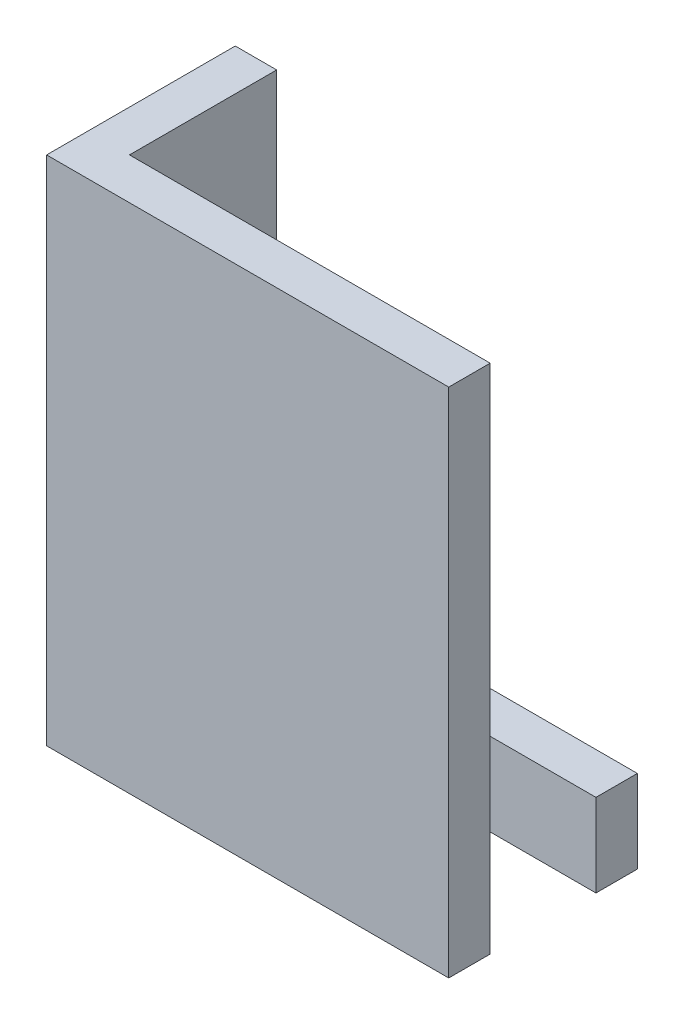
ISO-10303-21;
HEADER;
FILE_DESCRIPTION(('STEP AP214'),'2;1');
FILE_NAME('part.step','',(''),(''),'','','');
FILE_SCHEMA(('AUTOMOTIVE_DESIGN { 1 0 10303 214 1 1 1 1 }'));
ENDSEC;
DATA;
#1=APPLICATION_CONTEXT('core data for automotive mechanical design processes');
#2=APPLICATION_PROTOCOL_DEFINITION('international standard','automotive_design',2000,#1);
#3=PRODUCT_CONTEXT('',#1,'mechanical');
#4=PRODUCT('Part','Part','',(#3));
#5=PRODUCT_RELATED_PRODUCT_CATEGORY('part','',(#4));
#6=PRODUCT_DEFINITION_FORMATION('','',#4);
#7=PRODUCT_DEFINITION_CONTEXT('part definition',#1,'design');
#8=PRODUCT_DEFINITION('design','',#6,#7);
#9=PRODUCT_DEFINITION_SHAPE('','',#8);
#10=(LENGTH_UNIT() NAMED_UNIT(*) SI_UNIT(.MILLI.,.METRE.));
#11=(NAMED_UNIT(*) PLANE_ANGLE_UNIT() SI_UNIT($,.RADIAN.));
#12=(NAMED_UNIT(*) SI_UNIT($,.STERADIAN.) SOLID_ANGLE_UNIT());
#13=UNCERTAINTY_MEASURE_WITH_UNIT(LENGTH_MEASURE(1.E-05),#10,'distance_accuracy_value','');
#14=(GEOMETRIC_REPRESENTATION_CONTEXT(3) GLOBAL_UNCERTAINTY_ASSIGNED_CONTEXT((#13)) GLOBAL_UNIT_ASSIGNED_CONTEXT((#10,
#11,#12)) REPRESENTATION_CONTEXT('',''));
#15=CARTESIAN_POINT('',(0.,0.,0.));
#16=DIRECTION('',(0.,0.,1.));
#17=DIRECTION('',(1.,0.,0.));
#18=AXIS2_PLACEMENT_3D('',#15,#16,#17);
#19=CARTESIAN_POINT('',(0.244892720885212,37.06,8.58850832049055));
#20=DIRECTION('',(-1.,0.,0.));
#21=DIRECTION('',(0.,0.,1.));
#22=AXIS2_PLACEMENT_3D('',#19,#20,#21);
#23=PLANE('',#22);
#24=DIRECTION('',(0.,-1.,0.));
#25=VECTOR('',#24,1.);
#26=CARTESIAN_POINT('',(0.244892720885214,6.,11.5885083204905));
#27=LINE('',#26,#25);
#28=CARTESIAN_POINT('',(0.244892720885212,6.,11.5885083204905));
#29=VERTEX_POINT('',#28);
#30=CARTESIAN_POINT('',(0.244892720885212,0.,11.5885083204905));
#31=VERTEX_POINT('',#30);
#32=EDGE_CURVE('E55',#29,#31,#27,.T.);
#33=ORIENTED_EDGE('',*,*,#32,.F.);
#34=DIRECTION('',(0.,0.,1.));
#35=VECTOR('',#34,1.);
#36=CARTESIAN_POINT('',(0.244892720885214,6.,8.58850832049055));
#37=LINE('',#36,#35);
#38=CARTESIAN_POINT('',(0.244892720885212,6.,8.58850832049055));
#39=VERTEX_POINT('',#38);
#40=EDGE_CURVE('E60',#39,#29,#37,.T.);
#41=ORIENTED_EDGE('',*,*,#40,.F.);
#42=DIRECTION('',(0.,-1.,0.));
#43=VECTOR('',#42,1.);
#44=CARTESIAN_POINT('',(0.244892720885212,37.06,8.58850832049055));
#45=LINE('',#44,#43);
#46=CARTESIAN_POINT('',(0.244892720885212,37.06,8.58850832049055));
#47=VERTEX_POINT('',#46);
#48=EDGE_CURVE('E170',#47,#39,#45,.T.);
#49=ORIENTED_EDGE('',*,*,#48,.F.);
#50=DIRECTION('',(0.,0.,-1.));
#51=VECTOR('',#50,1.);
#52=CARTESIAN_POINT('',(0.244892720885212,37.06,8.58850832049055));
#53=LINE('',#52,#51);
#54=CARTESIAN_POINT('',(0.244892720885214,37.06,19.2485083204905));
#55=VERTEX_POINT('',#54);
#56=EDGE_CURVE('E167',#55,#47,#53,.T.);
#57=ORIENTED_EDGE('',*,*,#56,.F.);
#58=DIRECTION('',(0.,-1.,0.));
#59=VECTOR('',#58,1.);
#60=CARTESIAN_POINT('',(0.244892720885214,37.06,19.2485083204905));
#61=LINE('',#60,#59);
#62=CARTESIAN_POINT('',(0.244892720885214,0.,19.2485083204905));
#63=VERTEX_POINT('',#62);
#64=EDGE_CURVE('E190',#55,#63,#61,.T.);
#65=ORIENTED_EDGE('',*,*,#64,.T.);
#66=DIRECTION('',(0.,0.,-1.));
#67=VECTOR('',#66,1.);
#68=CARTESIAN_POINT('',(0.244892720885212,0.,8.58850832049055));
#69=LINE('',#68,#67);
#70=EDGE_CURVE('E155',#63,#31,#69,.T.);
#71=ORIENTED_EDGE('',*,*,#70,.T.);
#72=EDGE_LOOP('',(#33,#41,#49,#57,#65,#71));
#73=FACE_BOUND('',#72,.T.);
#74=ADVANCED_FACE('F39',(#73),#23,.F.);
#75=CARTESIAN_POINT('',(-2.75510727911479,37.06,8.58850832049055));
#76=DIRECTION('',(0.,0.,1.));
#77=DIRECTION('',(1.,0.,0.));
#78=AXIS2_PLACEMENT_3D('',#75,#76,#77);
#79=PLANE('',#78);
#80=DIRECTION('',(-1.,0.,0.));
#81=VECTOR('',#80,1.);
#82=CARTESIAN_POINT('',(-2.75510727911479,0.,8.58850832049055));
#83=LINE('',#82,#81);
#84=CARTESIAN_POINT('',(26.3648927208852,0.,8.58850832049055));
#85=VERTEX_POINT('',#84);
#86=CARTESIAN_POINT('',(-2.75510727911479,0.,8.58850832049055));
#87=VERTEX_POINT('',#86);
#88=EDGE_CURVE('E149',#85,#87,#83,.T.);
#89=ORIENTED_EDGE('',*,*,#88,.T.);
#90=DIRECTION('',(0.,-1.,0.));
#91=VECTOR('',#90,1.);
#92=CARTESIAN_POINT('',(-2.75510727911479,37.06,8.58850832049055));
#93=LINE('',#92,#91);
#94=CARTESIAN_POINT('',(-2.75510727911479,37.06,8.58850832049055));
#95=VERTEX_POINT('',#94);
#96=EDGE_CURVE('E11',#95,#87,#93,.T.);
#97=ORIENTED_EDGE('',*,*,#96,.F.);
#98=DIRECTION('',(-1.,0.,0.));
#99=VECTOR('',#98,1.);
#100=CARTESIAN_POINT('',(-2.75510727911479,37.06,8.58850832049055));
#101=LINE('',#100,#99);
#102=EDGE_CURVE('E150',#47,#95,#101,.T.);
#103=ORIENTED_EDGE('',*,*,#102,.F.);
#104=ORIENTED_EDGE('',*,*,#48,.T.);
#105=DIRECTION('',(-1.,0.,0.));
#106=VECTOR('',#105,1.);
#107=CARTESIAN_POINT('',(26.3648927208852,6.,8.58850832049055));
#108=LINE('',#107,#106);
#109=CARTESIAN_POINT('',(26.3648927208852,6.,8.58850832049055));
#110=VERTEX_POINT('',#109);
#111=EDGE_CURVE('E134',#110,#39,#108,.T.);
#112=ORIENTED_EDGE('',*,*,#111,.F.);
#113=DIRECTION('',(0.,-1.,0.));
#114=VECTOR('',#113,1.);
#115=CARTESIAN_POINT('',(26.3648927208852,6.,8.58850832049055));
#116=LINE('',#115,#114);
#117=EDGE_CURVE('E128',#110,#85,#116,.T.);
#118=ORIENTED_EDGE('',*,*,#117,.T.);
#119=EDGE_LOOP('',(#89,#97,#103,#104,#112,#118));
#120=FACE_BOUND('',#119,.T.);
#121=ADVANCED_FACE('F41',(#120),#79,.F.);
#122=CARTESIAN_POINT('',(-2.75510727911479,37.06,8.58850832049055));
#123=DIRECTION('',(1.,0.,0.));
#124=DIRECTION('',(0.,0.,-1.));
#125=AXIS2_PLACEMENT_3D('',#122,#123,#124);
#126=PLANE('',#125);
#127=DIRECTION('',(0.,0.,1.));
#128=VECTOR('',#127,1.);
#129=CARTESIAN_POINT('',(-2.75510727911479,0.,8.58850832049055));
#130=LINE('',#129,#128);
#131=CARTESIAN_POINT('',(-2.75510727911479,0.,22.2485083204905));
#132=VERTEX_POINT('',#131);
#133=EDGE_CURVE('E174',#87,#132,#130,.T.);
#134=ORIENTED_EDGE('',*,*,#133,.T.);
#135=DIRECTION('',(0.,-1.,0.));
#136=VECTOR('',#135,1.);
#137=CARTESIAN_POINT('',(-2.75510727911479,37.06,22.2485083204905));
#138=LINE('',#137,#136);
#139=CARTESIAN_POINT('',(-2.75510727911479,37.06,22.2485083204905));
#140=VERTEX_POINT('',#139);
#141=EDGE_CURVE('E48',#140,#132,#138,.T.);
#142=ORIENTED_EDGE('',*,*,#141,.F.);
#143=DIRECTION('',(0.,0.,1.));
#144=VECTOR('',#143,1.);
#145=CARTESIAN_POINT('',(-2.75510727911479,37.06,8.58850832049055));
#146=LINE('',#145,#144);
#147=EDGE_CURVE('E154',#95,#140,#146,.T.);
#148=ORIENTED_EDGE('',*,*,#147,.F.);
#149=ORIENTED_EDGE('',*,*,#96,.T.);
#150=EDGE_LOOP('',(#134,#142,#148,#149));
#151=FACE_BOUND('',#150,.T.);
#152=ADVANCED_FACE('F228',(#151),#126,.F.);
#153=CARTESIAN_POINT('',(-2.75510727911479,37.06,22.2485083204905));
#154=DIRECTION('',(0.,0.,-1.));
#155=DIRECTION('',(-1.,0.,0.));
#156=AXIS2_PLACEMENT_3D('',#153,#154,#155);
#157=PLANE('',#156);
#158=DIRECTION('',(1.,0.,0.));
#159=VECTOR('',#158,1.);
#160=CARTESIAN_POINT('',(-2.75510727911479,0.,22.2485083204905));
#161=LINE('',#160,#159);
#162=CARTESIAN_POINT('',(26.3648927208852,0.,22.2485083204905));
#163=VERTEX_POINT('',#162);
#164=EDGE_CURVE('E177',#132,#163,#161,.T.);
#165=ORIENTED_EDGE('',*,*,#164,.T.);
#166=DIRECTION('',(0.,-1.,0.));
#167=VECTOR('',#166,1.);
#168=CARTESIAN_POINT('',(26.3648927208852,37.06,22.2485083204905));
#169=LINE('',#168,#167);
#170=CARTESIAN_POINT('',(26.3648927208852,37.06,22.2485083204905));
#171=VERTEX_POINT('',#170);
#172=EDGE_CURVE('E198',#171,#163,#169,.T.);
#173=ORIENTED_EDGE('',*,*,#172,.F.);
#174=DIRECTION('',(1.,0.,0.));
#175=VECTOR('',#174,1.);
#176=CARTESIAN_POINT('',(-2.75510727911479,37.06,22.2485083204905));
#177=LINE('',#176,#175);
#178=EDGE_CURVE('E158',#140,#171,#177,.T.);
#179=ORIENTED_EDGE('',*,*,#178,.F.);
#180=ORIENTED_EDGE('',*,*,#141,.T.);
#181=EDGE_LOOP('',(#165,#173,#179,#180));
#182=FACE_BOUND('',#181,.T.);
#183=ADVANCED_FACE('F207',(#182),#157,.F.);
#184=CARTESIAN_POINT('',(26.3648927208852,37.06,19.2485083204905));
#185=DIRECTION('',(-1.,0.,0.));
#186=DIRECTION('',(0.,0.,1.));
#187=AXIS2_PLACEMENT_3D('',#184,#185,#186);
#188=PLANE('',#187);
#189=DIRECTION('',(0.,0.,-1.));
#190=VECTOR('',#189,1.);
#191=CARTESIAN_POINT('',(26.3648927208852,0.,19.2485083204905));
#192=LINE('',#191,#190);
#193=CARTESIAN_POINT('',(26.3648927208852,0.,19.2485083204905));
#194=VERTEX_POINT('',#193);
#195=EDGE_CURVE('E180',#163,#194,#192,.T.);
#196=ORIENTED_EDGE('',*,*,#195,.T.);
#197=DIRECTION('',(0.,-1.,0.));
#198=VECTOR('',#197,1.);
#199=CARTESIAN_POINT('',(26.3648927208852,37.06,19.2485083204905));
#200=LINE('',#199,#198);
#201=CARTESIAN_POINT('',(26.3648927208852,37.06,19.2485083204905));
#202=VERTEX_POINT('',#201);
#203=EDGE_CURVE('E194',#202,#194,#200,.T.);
#204=ORIENTED_EDGE('',*,*,#203,.F.);
#205=DIRECTION('',(0.,0.,-1.));
#206=VECTOR('',#205,1.);
#207=CARTESIAN_POINT('',(26.3648927208852,37.06,19.2485083204905));
#208=LINE('',#207,#206);
#209=EDGE_CURVE('E161',#171,#202,#208,.T.);
#210=ORIENTED_EDGE('',*,*,#209,.F.);
#211=ORIENTED_EDGE('',*,*,#172,.T.);
#212=EDGE_LOOP('',(#196,#204,#210,#211));
#213=FACE_BOUND('',#212,.T.);
#214=ADVANCED_FACE('F217',(#213),#188,.F.);
#215=CARTESIAN_POINT('',(0.244892720885214,37.06,19.2485083204905));
#216=DIRECTION('',(0.,0.,1.));
#217=DIRECTION('',(1.,0.,0.));
#218=AXIS2_PLACEMENT_3D('',#215,#216,#217);
#219=PLANE('',#218);
#220=DIRECTION('',(-1.,0.,0.));
#221=VECTOR('',#220,1.);
#222=CARTESIAN_POINT('',(0.244892720885214,0.,19.2485083204905));
#223=LINE('',#222,#221);
#224=EDGE_CURVE('E183',#194,#63,#223,.T.);
#225=ORIENTED_EDGE('',*,*,#224,.T.);
#226=ORIENTED_EDGE('',*,*,#64,.F.);
#227=DIRECTION('',(-1.,0.,0.));
#228=VECTOR('',#227,1.);
#229=CARTESIAN_POINT('',(0.244892720885214,37.06,19.2485083204905));
#230=LINE('',#229,#228);
#231=EDGE_CURVE('E164',#202,#55,#230,.T.);
#232=ORIENTED_EDGE('',*,*,#231,.F.);
#233=ORIENTED_EDGE('',*,*,#203,.T.);
#234=EDGE_LOOP('',(#225,#226,#232,#233));
#235=FACE_BOUND('',#234,.T.);
#236=ADVANCED_FACE('F221',(#235),#219,.F.);
#237=CARTESIAN_POINT('',(0.,37.06,0.));
#238=DIRECTION('',(0.,-1.,0.));
#239=DIRECTION('',(0.,0.,-1.));
#240=AXIS2_PLACEMENT_3D('',#237,#238,#239);
#241=PLANE('',#240);
#242=ORIENTED_EDGE('',*,*,#102,.T.);
#243=ORIENTED_EDGE('',*,*,#147,.T.);
#244=ORIENTED_EDGE('',*,*,#178,.T.);
#245=ORIENTED_EDGE('',*,*,#209,.T.);
#246=ORIENTED_EDGE('',*,*,#231,.T.);
#247=ORIENTED_EDGE('',*,*,#56,.T.);
#248=EDGE_LOOP('',(#242,#243,#244,#245,#246,#247));
#249=FACE_BOUND('',#248,.T.);
#250=ADVANCED_FACE('F225',(#249),#241,.F.);
#251=CARTESIAN_POINT('',(0.,0.,0.));
#252=DIRECTION('',(0.,-1.,0.));
#253=DIRECTION('',(0.,0.,-1.));
#254=AXIS2_PLACEMENT_3D('',#251,#252,#253);
#255=PLANE('',#254);
#256=ORIENTED_EDGE('',*,*,#88,.F.);
#257=DIRECTION('',(0.,0.,-1.));
#258=VECTOR('',#257,1.);
#259=CARTESIAN_POINT('',(26.3648927208852,0.,11.5885083204905));
#260=LINE('',#259,#258);
#261=CARTESIAN_POINT('',(26.3648927208852,0.,11.5885083204905));
#262=VERTEX_POINT('',#261);
#263=EDGE_CURVE('E142',#262,#85,#260,.T.);
#264=ORIENTED_EDGE('',*,*,#263,.F.);
#265=DIRECTION('',(1.,0.,0.));
#266=VECTOR('',#265,1.);
#267=CARTESIAN_POINT('',(0.244892720885214,0.,11.5885083204905));
#268=LINE('',#267,#266);
#269=EDGE_CURVE('E123',#31,#262,#268,.T.);
#270=ORIENTED_EDGE('',*,*,#269,.F.);
#271=ORIENTED_EDGE('',*,*,#70,.F.);
#272=ORIENTED_EDGE('',*,*,#224,.F.);
#273=ORIENTED_EDGE('',*,*,#195,.F.);
#274=ORIENTED_EDGE('',*,*,#164,.F.);
#275=ORIENTED_EDGE('',*,*,#133,.F.);
#276=EDGE_LOOP('',(#256,#264,#270,#271,#272,#273,#274,#275));
#277=FACE_BOUND('',#276,.T.);
#278=ADVANCED_FACE('F212',(#277),#255,.T.);
#279=CARTESIAN_POINT('',(0.244892720885214,6.,11.5885083204905));
#280=DIRECTION('',(0.,0.,-1.));
#281=DIRECTION('',(-1.,0.,0.));
#282=AXIS2_PLACEMENT_3D('',#279,#280,#281);
#283=PLANE('',#282);
#284=ORIENTED_EDGE('',*,*,#269,.T.);
#285=DIRECTION('',(0.,-1.,0.));
#286=VECTOR('',#285,1.);
#287=CARTESIAN_POINT('',(26.3648927208852,6.,11.5885083204905));
#288=LINE('',#287,#286);
#289=CARTESIAN_POINT('',(26.3648927208852,6.,11.5885083204905));
#290=VERTEX_POINT('',#289);
#291=EDGE_CURVE('E120',#290,#262,#288,.T.);
#292=ORIENTED_EDGE('',*,*,#291,.F.);
#293=DIRECTION('',(1.,0.,0.));
#294=VECTOR('',#293,1.);
#295=CARTESIAN_POINT('',(0.244892720885214,6.,11.5885083204905));
#296=LINE('',#295,#294);
#297=EDGE_CURVE('E109',#29,#290,#296,.T.);
#298=ORIENTED_EDGE('',*,*,#297,.F.);
#299=ORIENTED_EDGE('',*,*,#32,.T.);
#300=EDGE_LOOP('',(#284,#292,#298,#299));
#301=FACE_BOUND('',#300,.T.);
#302=ADVANCED_FACE('F121',(#301),#283,.F.);
#303=CARTESIAN_POINT('',(26.3648927208852,6.,11.5885083204905));
#304=DIRECTION('',(-1.,0.,0.));
#305=DIRECTION('',(0.,0.,1.));
#306=AXIS2_PLACEMENT_3D('',#303,#304,#305);
#307=PLANE('',#306);
#308=ORIENTED_EDGE('',*,*,#263,.T.);
#309=ORIENTED_EDGE('',*,*,#117,.F.);
#310=DIRECTION('',(0.,0.,-1.));
#311=VECTOR('',#310,1.);
#312=CARTESIAN_POINT('',(26.3648927208852,6.,11.5885083204905));
#313=LINE('',#312,#311);
#314=EDGE_CURVE('E114',#290,#110,#313,.T.);
#315=ORIENTED_EDGE('',*,*,#314,.F.);
#316=ORIENTED_EDGE('',*,*,#291,.T.);
#317=EDGE_LOOP('',(#308,#309,#315,#316));
#318=FACE_BOUND('',#317,.T.);
#319=ADVANCED_FACE('F130',(#318),#307,.F.);
#320=CARTESIAN_POINT('',(0.,6.,0.));
#321=DIRECTION('',(0.,1.,0.));
#322=DIRECTION('',(0.,0.,1.));
#323=AXIS2_PLACEMENT_3D('',#320,#321,#322);
#324=PLANE('',#323);
#325=ORIENTED_EDGE('',*,*,#40,.T.);
#326=ORIENTED_EDGE('',*,*,#297,.T.);
#327=ORIENTED_EDGE('',*,*,#314,.T.);
#328=ORIENTED_EDGE('',*,*,#111,.T.);
#329=EDGE_LOOP('',(#325,#326,#327,#328));
#330=FACE_BOUND('',#329,.T.);
#331=ADVANCED_FACE('F111',(#330),#324,.T.);
#332=CLOSED_SHELL('',(#74,#121,#152,#183,#214,#236,#250,#278,#302,#319,#331));
#333=MANIFOLD_SOLID_BREP('B2',#332);
#334=ADVANCED_BREP_SHAPE_REPRESENTATION('',(#18,#333),#14);
#335=SHAPE_DEFINITION_REPRESENTATION(#9,#334);
ENDSEC;
END-ISO-10303-21;
